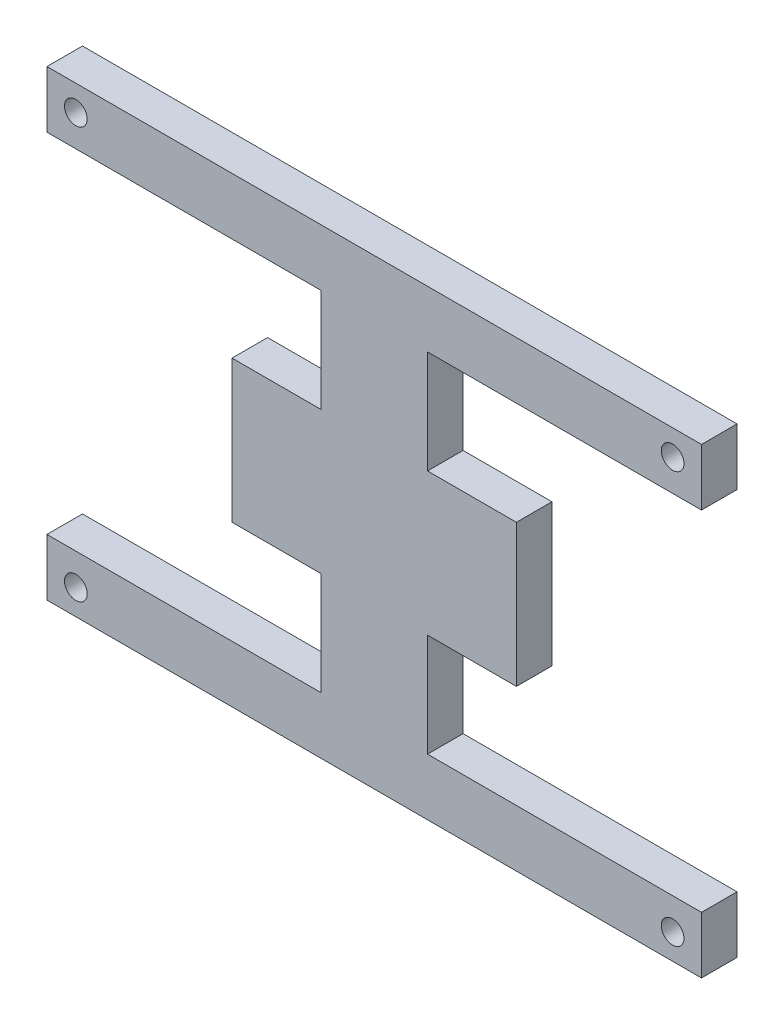
ISO-10303-21;
HEADER;
FILE_DESCRIPTION(('STEP AP214'),'2;1');
FILE_NAME('part.step','',(''),(''),'','','');
FILE_SCHEMA(('AUTOMOTIVE_DESIGN { 1 0 10303 214 1 1 1 1 }'));
ENDSEC;
DATA;
#1=APPLICATION_CONTEXT('core data for automotive mechanical design processes');
#2=APPLICATION_PROTOCOL_DEFINITION('international standard','automotive_design',2000,#1);
#3=PRODUCT_CONTEXT('',#1,'mechanical');
#4=PRODUCT('Part','Part','',(#3));
#5=PRODUCT_RELATED_PRODUCT_CATEGORY('part','',(#4));
#6=PRODUCT_DEFINITION_FORMATION('','',#4);
#7=PRODUCT_DEFINITION_CONTEXT('part definition',#1,'design');
#8=PRODUCT_DEFINITION('design','',#6,#7);
#9=PRODUCT_DEFINITION_SHAPE('','',#8);
#10=(LENGTH_UNIT() NAMED_UNIT(*) SI_UNIT(.MILLI.,.METRE.));
#11=(NAMED_UNIT(*) PLANE_ANGLE_UNIT() SI_UNIT($,.RADIAN.));
#12=(NAMED_UNIT(*) SI_UNIT($,.STERADIAN.) SOLID_ANGLE_UNIT());
#13=UNCERTAINTY_MEASURE_WITH_UNIT(LENGTH_MEASURE(1.E-05),#10,'distance_accuracy_value','');
#14=(GEOMETRIC_REPRESENTATION_CONTEXT(3) GLOBAL_UNCERTAINTY_ASSIGNED_CONTEXT((#13)) GLOBAL_UNIT_ASSIGNED_CONTEXT((#10,
#11,#12)) REPRESENTATION_CONTEXT('',''));
#15=CARTESIAN_POINT('',(0.,0.,0.));
#16=DIRECTION('',(0.,0.,1.));
#17=DIRECTION('',(1.,0.,0.));
#18=AXIS2_PLACEMENT_3D('',#15,#16,#17);
#19=CARTESIAN_POINT('',(46.0375,0.,5.));
#20=DIRECTION('',(1.,0.,0.));
#21=DIRECTION('',(0.,0.,-1.));
#22=AXIS2_PLACEMENT_3D('',#19,#20,#21);
#23=PLANE('',#22);
#24=DIRECTION('',(0.,-1.,0.));
#25=VECTOR('',#24,1.);
#26=CARTESIAN_POINT('',(46.0375,0.,0.));
#27=LINE('',#26,#25);
#28=CARTESIAN_POINT('',(46.0375,32.5,0.));
#29=VERTEX_POINT('',#28);
#30=CARTESIAN_POINT('',(46.0375,24.5,0.));
#31=VERTEX_POINT('',#30);
#32=EDGE_CURVE('E218',#29,#31,#27,.T.);
#33=ORIENTED_EDGE('',*,*,#32,.F.);
#34=DIRECTION('',(0.,0.,-1.));
#35=VECTOR('',#34,1.);
#36=CARTESIAN_POINT('',(46.0375,32.5,5.));
#37=LINE('',#36,#35);
#38=CARTESIAN_POINT('',(46.0375,32.5,5.));
#39=VERTEX_POINT('',#38);
#40=EDGE_CURVE('E11',#39,#29,#37,.T.);
#41=ORIENTED_EDGE('',*,*,#40,.F.);
#42=DIRECTION('',(0.,-1.,0.));
#43=VECTOR('',#42,1.);
#44=CARTESIAN_POINT('',(46.0375,0.,5.));
#45=LINE('',#44,#43);
#46=CARTESIAN_POINT('',(46.0375,24.5,5.));
#47=VERTEX_POINT('',#46);
#48=EDGE_CURVE('E678',#39,#47,#45,.T.);
#49=ORIENTED_EDGE('',*,*,#48,.T.);
#50=DIRECTION('',(0.,0.,-1.));
#51=VECTOR('',#50,1.);
#52=CARTESIAN_POINT('',(46.0375,24.5,5.));
#53=LINE('',#52,#51);
#54=EDGE_CURVE('E125',#47,#31,#53,.T.);
#55=ORIENTED_EDGE('',*,*,#54,.T.);
#56=EDGE_LOOP('',(#33,#41,#49,#55));
#57=FACE_BOUND('',#56,.T.);
#58=ADVANCED_FACE('F37',(#57),#23,.T.);
#59=CARTESIAN_POINT('',(0.,32.5,5.));
#60=DIRECTION('',(0.,1.,0.));
#61=DIRECTION('',(0.,0.,1.));
#62=AXIS2_PLACEMENT_3D('',#59,#60,#61);
#63=PLANE('',#62);
#64=DIRECTION('',(1.,0.,0.));
#65=VECTOR('',#64,1.);
#66=CARTESIAN_POINT('',(0.,32.5,0.));
#67=LINE('',#66,#65);
#68=CARTESIAN_POINT('',(-46.0375,32.5,0.));
#69=VERTEX_POINT('',#68);
#70=EDGE_CURVE('E220',#69,#29,#67,.T.);
#71=ORIENTED_EDGE('',*,*,#70,.F.);
#72=DIRECTION('',(0.,0.,-1.));
#73=VECTOR('',#72,1.);
#74=CARTESIAN_POINT('',(-46.0375,32.5,5.));
#75=LINE('',#74,#73);
#76=CARTESIAN_POINT('',(-46.0375,32.5,5.));
#77=VERTEX_POINT('',#76);
#78=EDGE_CURVE('E46',#77,#69,#75,.T.);
#79=ORIENTED_EDGE('',*,*,#78,.F.);
#80=DIRECTION('',(1.,0.,0.));
#81=VECTOR('',#80,1.);
#82=CARTESIAN_POINT('',(0.,32.5,5.));
#83=LINE('',#82,#81);
#84=EDGE_CURVE('E325',#77,#39,#83,.T.);
#85=ORIENTED_EDGE('',*,*,#84,.T.);
#86=ORIENTED_EDGE('',*,*,#40,.T.);
#87=EDGE_LOOP('',(#71,#79,#85,#86));
#88=FACE_BOUND('',#87,.T.);
#89=ADVANCED_FACE('F324',(#88),#63,.T.);
#90=CARTESIAN_POINT('',(-46.0375,0.,5.));
#91=DIRECTION('',(1.,0.,0.));
#92=DIRECTION('',(0.,1.,0.));
#93=AXIS2_PLACEMENT_3D('',#90,#91,#92);
#94=PLANE('',#93);
#95=DIRECTION('',(0.,-1.,0.));
#96=VECTOR('',#95,1.);
#97=CARTESIAN_POINT('',(-46.0375,0.,0.));
#98=LINE('',#97,#96);
#99=CARTESIAN_POINT('',(-46.0375,24.5,0.));
#100=VERTEX_POINT('',#99);
#101=EDGE_CURVE('E223',#69,#100,#98,.T.);
#102=ORIENTED_EDGE('',*,*,#101,.T.);
#103=DIRECTION('',(0.,0.,-1.));
#104=VECTOR('',#103,1.);
#105=CARTESIAN_POINT('',(-46.0375,24.5,5.));
#106=LINE('',#105,#104);
#107=CARTESIAN_POINT('',(-46.0375,24.5,5.));
#108=VERTEX_POINT('',#107);
#109=EDGE_CURVE('E309',#108,#100,#106,.T.);
#110=ORIENTED_EDGE('',*,*,#109,.F.);
#111=DIRECTION('',(0.,-1.,0.));
#112=VECTOR('',#111,1.);
#113=CARTESIAN_POINT('',(-46.0375,0.,5.));
#114=LINE('',#113,#112);
#115=EDGE_CURVE('E317',#77,#108,#114,.T.);
#116=ORIENTED_EDGE('',*,*,#115,.F.);
#117=ORIENTED_EDGE('',*,*,#78,.T.);
#118=EDGE_LOOP('',(#102,#110,#116,#117));
#119=FACE_BOUND('',#118,.T.);
#120=ADVANCED_FACE('F314',(#119),#94,.F.);
#121=CARTESIAN_POINT('',(0.,24.5,5.));
#122=DIRECTION('',(0.,1.,0.));
#123=DIRECTION('',(0.,0.,1.));
#124=AXIS2_PLACEMENT_3D('',#121,#122,#123);
#125=PLANE('',#124);
#126=DIRECTION('',(1.,0.,0.));
#127=VECTOR('',#126,1.);
#128=CARTESIAN_POINT('',(0.,24.5,0.));
#129=LINE('',#128,#127);
#130=CARTESIAN_POINT('',(-7.5,24.5,0.));
#131=VERTEX_POINT('',#130);
#132=EDGE_CURVE('E226',#100,#131,#129,.T.);
#133=ORIENTED_EDGE('',*,*,#132,.T.);
#134=DIRECTION('',(0.,0.,-1.));
#135=VECTOR('',#134,1.);
#136=CARTESIAN_POINT('',(-7.5,24.5,5.));
#137=LINE('',#136,#135);
#138=CARTESIAN_POINT('',(-7.5,24.5,5.));
#139=VERTEX_POINT('',#138);
#140=EDGE_CURVE('E307',#139,#131,#137,.T.);
#141=ORIENTED_EDGE('',*,*,#140,.F.);
#142=DIRECTION('',(1.,0.,0.));
#143=VECTOR('',#142,1.);
#144=CARTESIAN_POINT('',(0.,24.5,5.));
#145=LINE('',#144,#143);
#146=EDGE_CURVE('E436',#108,#139,#145,.T.);
#147=ORIENTED_EDGE('',*,*,#146,.F.);
#148=ORIENTED_EDGE('',*,*,#109,.T.);
#149=EDGE_LOOP('',(#133,#141,#147,#148));
#150=FACE_BOUND('',#149,.T.);
#151=ADVANCED_FACE('F346',(#150),#125,.F.);
#152=CARTESIAN_POINT('',(-7.5,0.,5.));
#153=DIRECTION('',(-1.,0.,0.));
#154=DIRECTION('',(0.,0.,1.));
#155=AXIS2_PLACEMENT_3D('',#152,#153,#154);
#156=PLANE('',#155);
#157=DIRECTION('',(0.,1.,0.));
#158=VECTOR('',#157,1.);
#159=CARTESIAN_POINT('',(-7.5,0.,0.));
#160=LINE('',#159,#158);
#161=CARTESIAN_POINT('',(-7.5,10.,0.));
#162=VERTEX_POINT('',#161);
#163=EDGE_CURVE('E229',#162,#131,#160,.T.);
#164=ORIENTED_EDGE('',*,*,#163,.F.);
#165=DIRECTION('',(0.,0.,-1.));
#166=VECTOR('',#165,1.);
#167=CARTESIAN_POINT('',(-7.5,10.,5.));
#168=LINE('',#167,#166);
#169=CARTESIAN_POINT('',(-7.5,10.,5.));
#170=VERTEX_POINT('',#169);
#171=EDGE_CURVE('E305',#170,#162,#168,.T.);
#172=ORIENTED_EDGE('',*,*,#171,.F.);
#173=DIRECTION('',(0.,1.,0.));
#174=VECTOR('',#173,1.);
#175=CARTESIAN_POINT('',(-7.5,0.,5.));
#176=LINE('',#175,#174);
#177=EDGE_CURVE('E432',#170,#139,#176,.T.);
#178=ORIENTED_EDGE('',*,*,#177,.T.);
#179=ORIENTED_EDGE('',*,*,#140,.T.);
#180=EDGE_LOOP('',(#164,#172,#178,#179));
#181=FACE_BOUND('',#180,.T.);
#182=ADVANCED_FACE('F416',(#181),#156,.T.);
#183=CARTESIAN_POINT('',(0.,10.,5.));
#184=DIRECTION('',(0.,1.,0.));
#185=DIRECTION('',(0.,0.,1.));
#186=AXIS2_PLACEMENT_3D('',#183,#184,#185);
#187=PLANE('',#186);
#188=DIRECTION('',(1.,0.,0.));
#189=VECTOR('',#188,1.);
#190=CARTESIAN_POINT('',(0.,10.,0.));
#191=LINE('',#190,#189);
#192=CARTESIAN_POINT('',(-20.,10.,0.));
#193=VERTEX_POINT('',#192);
#194=EDGE_CURVE('E232',#193,#162,#191,.T.);
#195=ORIENTED_EDGE('',*,*,#194,.F.);
#196=DIRECTION('',(0.,0.,-1.));
#197=VECTOR('',#196,1.);
#198=CARTESIAN_POINT('',(-20.,10.,5.));
#199=LINE('',#198,#197);
#200=CARTESIAN_POINT('',(-20.,10.,5.));
#201=VERTEX_POINT('',#200);
#202=EDGE_CURVE('E303',#201,#193,#199,.T.);
#203=ORIENTED_EDGE('',*,*,#202,.F.);
#204=DIRECTION('',(1.,0.,0.));
#205=VECTOR('',#204,1.);
#206=CARTESIAN_POINT('',(0.,10.,5.));
#207=LINE('',#206,#205);
#208=EDGE_CURVE('E435',#201,#170,#207,.T.);
#209=ORIENTED_EDGE('',*,*,#208,.T.);
#210=ORIENTED_EDGE('',*,*,#171,.T.);
#211=EDGE_LOOP('',(#195,#203,#209,#210));
#212=FACE_BOUND('',#211,.T.);
#213=ADVANCED_FACE('F412',(#212),#187,.T.);
#214=CARTESIAN_POINT('',(-20.,0.,5.));
#215=DIRECTION('',(-1.,0.,0.));
#216=DIRECTION('',(0.,0.,1.));
#217=AXIS2_PLACEMENT_3D('',#214,#215,#216);
#218=PLANE('',#217);
#219=DIRECTION('',(0.,1.,0.));
#220=VECTOR('',#219,1.);
#221=CARTESIAN_POINT('',(-20.,0.,0.));
#222=LINE('',#221,#220);
#223=CARTESIAN_POINT('',(-20.,-10.,0.));
#224=VERTEX_POINT('',#223);
#225=EDGE_CURVE('E235',#224,#193,#222,.T.);
#226=ORIENTED_EDGE('',*,*,#225,.F.);
#227=DIRECTION('',(0.,0.,-1.));
#228=VECTOR('',#227,1.);
#229=CARTESIAN_POINT('',(-20.,-10.,5.));
#230=LINE('',#229,#228);
#231=CARTESIAN_POINT('',(-20.,-10.,5.));
#232=VERTEX_POINT('',#231);
#233=EDGE_CURVE('E301',#232,#224,#230,.T.);
#234=ORIENTED_EDGE('',*,*,#233,.F.);
#235=DIRECTION('',(0.,1.,0.));
#236=VECTOR('',#235,1.);
#237=CARTESIAN_POINT('',(-20.,0.,5.));
#238=LINE('',#237,#236);
#239=EDGE_CURVE('E438',#232,#201,#238,.T.);
#240=ORIENTED_EDGE('',*,*,#239,.T.);
#241=ORIENTED_EDGE('',*,*,#202,.T.);
#242=EDGE_LOOP('',(#226,#234,#240,#241));
#243=FACE_BOUND('',#242,.T.);
#244=ADVANCED_FACE('F408',(#243),#218,.T.);
#245=CARTESIAN_POINT('',(0.,-10.,5.));
#246=DIRECTION('',(0.,1.,0.));
#247=DIRECTION('',(0.,0.,1.));
#248=AXIS2_PLACEMENT_3D('',#245,#246,#247);
#249=PLANE('',#248);
#250=DIRECTION('',(1.,0.,0.));
#251=VECTOR('',#250,1.);
#252=CARTESIAN_POINT('',(0.,-10.,0.));
#253=LINE('',#252,#251);
#254=CARTESIAN_POINT('',(-7.5,-10.,0.));
#255=VERTEX_POINT('',#254);
#256=EDGE_CURVE('E238',#224,#255,#253,.T.);
#257=ORIENTED_EDGE('',*,*,#256,.T.);
#258=DIRECTION('',(0.,0.,-1.));
#259=VECTOR('',#258,1.);
#260=CARTESIAN_POINT('',(-7.5,-10.,5.));
#261=LINE('',#260,#259);
#262=CARTESIAN_POINT('',(-7.5,-10.,5.));
#263=VERTEX_POINT('',#262);
#264=EDGE_CURVE('E299',#263,#255,#261,.T.);
#265=ORIENTED_EDGE('',*,*,#264,.F.);
#266=DIRECTION('',(1.,0.,0.));
#267=VECTOR('',#266,1.);
#268=CARTESIAN_POINT('',(0.,-10.,5.));
#269=LINE('',#268,#267);
#270=EDGE_CURVE('E445',#232,#263,#269,.T.);
#271=ORIENTED_EDGE('',*,*,#270,.F.);
#272=ORIENTED_EDGE('',*,*,#233,.T.);
#273=EDGE_LOOP('',(#257,#265,#271,#272));
#274=FACE_BOUND('',#273,.T.);
#275=ADVANCED_FACE('F404',(#274),#249,.F.);
#276=CARTESIAN_POINT('',(-7.5,0.,5.));
#277=DIRECTION('',(-1.,0.,0.));
#278=DIRECTION('',(0.,0.,1.));
#279=AXIS2_PLACEMENT_3D('',#276,#277,#278);
#280=PLANE('',#279);
#281=DIRECTION('',(0.,1.,0.));
#282=VECTOR('',#281,1.);
#283=CARTESIAN_POINT('',(-7.5,0.,0.));
#284=LINE('',#283,#282);
#285=CARTESIAN_POINT('',(-7.5,-24.5,0.));
#286=VERTEX_POINT('',#285);
#287=EDGE_CURVE('E241',#286,#255,#284,.T.);
#288=ORIENTED_EDGE('',*,*,#287,.F.);
#289=DIRECTION('',(0.,0.,-1.));
#290=VECTOR('',#289,1.);
#291=CARTESIAN_POINT('',(-7.5,-24.5,5.));
#292=LINE('',#291,#290);
#293=CARTESIAN_POINT('',(-7.5,-24.5,5.));
#294=VERTEX_POINT('',#293);
#295=EDGE_CURVE('E297',#294,#286,#292,.T.);
#296=ORIENTED_EDGE('',*,*,#295,.F.);
#297=DIRECTION('',(0.,1.,0.));
#298=VECTOR('',#297,1.);
#299=CARTESIAN_POINT('',(-7.5,0.,5.));
#300=LINE('',#299,#298);
#301=EDGE_CURVE('E447',#294,#263,#300,.T.);
#302=ORIENTED_EDGE('',*,*,#301,.T.);
#303=ORIENTED_EDGE('',*,*,#264,.T.);
#304=EDGE_LOOP('',(#288,#296,#302,#303));
#305=FACE_BOUND('',#304,.T.);
#306=ADVANCED_FACE('F401',(#305),#280,.T.);
#307=CARTESIAN_POINT('',(0.,-24.5,5.));
#308=DIRECTION('',(0.,-1.,0.));
#309=DIRECTION('',(1.,0.,0.));
#310=AXIS2_PLACEMENT_3D('',#307,#308,#309);
#311=PLANE('',#310);
#312=DIRECTION('',(-1.,0.,0.));
#313=VECTOR('',#312,1.);
#314=CARTESIAN_POINT('',(0.,-24.5,0.));
#315=LINE('',#314,#313);
#316=CARTESIAN_POINT('',(-46.0375,-24.5,0.));
#317=VERTEX_POINT('',#316);
#318=EDGE_CURVE('E244',#286,#317,#315,.T.);
#319=ORIENTED_EDGE('',*,*,#318,.T.);
#320=DIRECTION('',(0.,0.,-1.));
#321=VECTOR('',#320,1.);
#322=CARTESIAN_POINT('',(-46.0375,-24.5,5.));
#323=LINE('',#322,#321);
#324=CARTESIAN_POINT('',(-46.0375,-24.5,5.));
#325=VERTEX_POINT('',#324);
#326=EDGE_CURVE('E295',#325,#317,#323,.T.);
#327=ORIENTED_EDGE('',*,*,#326,.F.);
#328=DIRECTION('',(-1.,0.,0.));
#329=VECTOR('',#328,1.);
#330=CARTESIAN_POINT('',(0.,-24.5,5.));
#331=LINE('',#330,#329);
#332=EDGE_CURVE('E450',#294,#325,#331,.T.);
#333=ORIENTED_EDGE('',*,*,#332,.F.);
#334=ORIENTED_EDGE('',*,*,#295,.T.);
#335=EDGE_LOOP('',(#319,#327,#333,#334));
#336=FACE_BOUND('',#335,.T.);
#337=ADVANCED_FACE('F389',(#336),#311,.F.);
#338=CARTESIAN_POINT('',(-46.0375,0.,5.));
#339=DIRECTION('',(-1.,0.,0.));
#340=DIRECTION('',(0.,-1.,0.));
#341=AXIS2_PLACEMENT_3D('',#338,#339,#340);
#342=PLANE('',#341);
#343=DIRECTION('',(0.,1.,0.));
#344=VECTOR('',#343,1.);
#345=CARTESIAN_POINT('',(-46.0375,0.,0.));
#346=LINE('',#345,#344);
#347=CARTESIAN_POINT('',(-46.0375,-32.5,0.));
#348=VERTEX_POINT('',#347);
#349=EDGE_CURVE('E247',#348,#317,#346,.T.);
#350=ORIENTED_EDGE('',*,*,#349,.F.);
#351=DIRECTION('',(0.,0.,-1.));
#352=VECTOR('',#351,1.);
#353=CARTESIAN_POINT('',(-46.0375,-32.5,5.));
#354=LINE('',#353,#352);
#355=CARTESIAN_POINT('',(-46.0375,-32.5,5.));
#356=VERTEX_POINT('',#355);
#357=EDGE_CURVE('E293',#356,#348,#354,.T.);
#358=ORIENTED_EDGE('',*,*,#357,.F.);
#359=DIRECTION('',(0.,1.,0.));
#360=VECTOR('',#359,1.);
#361=CARTESIAN_POINT('',(-46.0375,0.,5.));
#362=LINE('',#361,#360);
#363=EDGE_CURVE('E452',#356,#325,#362,.T.);
#364=ORIENTED_EDGE('',*,*,#363,.T.);
#365=ORIENTED_EDGE('',*,*,#326,.T.);
#366=EDGE_LOOP('',(#350,#358,#364,#365));
#367=FACE_BOUND('',#366,.T.);
#368=ADVANCED_FACE('F396',(#367),#342,.T.);
#369=CARTESIAN_POINT('',(0.,-32.5,5.));
#370=DIRECTION('',(0.,-1.,0.));
#371=DIRECTION('',(0.,0.,-1.));
#372=AXIS2_PLACEMENT_3D('',#369,#370,#371);
#373=PLANE('',#372);
#374=DIRECTION('',(-1.,0.,0.));
#375=VECTOR('',#374,1.);
#376=CARTESIAN_POINT('',(0.,-32.5,0.));
#377=LINE('',#376,#375);
#378=CARTESIAN_POINT('',(46.0375,-32.5,0.));
#379=VERTEX_POINT('',#378);
#380=EDGE_CURVE('E251',#379,#348,#377,.T.);
#381=ORIENTED_EDGE('',*,*,#380,.F.);
#382=DIRECTION('',(0.,0.,-1.));
#383=VECTOR('',#382,1.);
#384=CARTESIAN_POINT('',(46.0375,-32.5,5.));
#385=LINE('',#384,#383);
#386=CARTESIAN_POINT('',(46.0375,-32.5,5.));
#387=VERTEX_POINT('',#386);
#388=EDGE_CURVE('E291',#387,#379,#385,.T.);
#389=ORIENTED_EDGE('',*,*,#388,.F.);
#390=DIRECTION('',(-1.,0.,0.));
#391=VECTOR('',#390,1.);
#392=CARTESIAN_POINT('',(0.,-32.5,5.));
#393=LINE('',#392,#391);
#394=EDGE_CURVE('E456',#387,#356,#393,.T.);
#395=ORIENTED_EDGE('',*,*,#394,.T.);
#396=ORIENTED_EDGE('',*,*,#357,.T.);
#397=EDGE_LOOP('',(#381,#389,#395,#396));
#398=FACE_BOUND('',#397,.T.);
#399=ADVANCED_FACE('F392',(#398),#373,.T.);
#400=CARTESIAN_POINT('',(46.0375,0.,5.));
#401=DIRECTION('',(-1.,0.,0.));
#402=DIRECTION('',(0.,0.,1.));
#403=AXIS2_PLACEMENT_3D('',#400,#401,#402);
#404=PLANE('',#403);
#405=DIRECTION('',(0.,1.,0.));
#406=VECTOR('',#405,1.);
#407=CARTESIAN_POINT('',(46.0375,0.,0.));
#408=LINE('',#407,#406);
#409=CARTESIAN_POINT('',(46.0375,-24.5,0.));
#410=VERTEX_POINT('',#409);
#411=EDGE_CURVE('E254',#379,#410,#408,.T.);
#412=ORIENTED_EDGE('',*,*,#411,.T.);
#413=DIRECTION('',(0.,0.,-1.));
#414=VECTOR('',#413,1.);
#415=CARTESIAN_POINT('',(46.0375,-24.5,5.));
#416=LINE('',#415,#414);
#417=CARTESIAN_POINT('',(46.0375,-24.5,5.));
#418=VERTEX_POINT('',#417);
#419=EDGE_CURVE('E288',#418,#410,#416,.T.);
#420=ORIENTED_EDGE('',*,*,#419,.F.);
#421=DIRECTION('',(0.,1.,0.));
#422=VECTOR('',#421,1.);
#423=CARTESIAN_POINT('',(46.0375,0.,5.));
#424=LINE('',#423,#422);
#425=EDGE_CURVE('E459',#387,#418,#424,.T.);
#426=ORIENTED_EDGE('',*,*,#425,.F.);
#427=ORIENTED_EDGE('',*,*,#388,.T.);
#428=EDGE_LOOP('',(#412,#420,#426,#427));
#429=FACE_BOUND('',#428,.T.);
#430=ADVANCED_FACE('F387',(#429),#404,.F.);
#431=CARTESIAN_POINT('',(7.5,-24.5,0.));
#432=VERTEX_POINT('',#431);
#433=EDGE_CURVE('E248',#410,#432,#315,.T.);
#434=ORIENTED_EDGE('',*,*,#433,.T.);
#435=DIRECTION('',(0.,0.,-1.));
#436=VECTOR('',#435,1.);
#437=CARTESIAN_POINT('',(7.5,-24.5,5.));
#438=LINE('',#437,#436);
#439=CARTESIAN_POINT('',(7.5,-24.5,5.));
#440=VERTEX_POINT('',#439);
#441=EDGE_CURVE('E285',#440,#432,#438,.T.);
#442=ORIENTED_EDGE('',*,*,#441,.F.);
#443=EDGE_CURVE('E453',#418,#440,#331,.T.);
#444=ORIENTED_EDGE('',*,*,#443,.F.);
#445=ORIENTED_EDGE('',*,*,#419,.T.);
#446=EDGE_LOOP('',(#434,#442,#444,#445));
#447=FACE_BOUND('',#446,.T.);
#448=ADVANCED_FACE('F383',(#447),#311,.F.);
#449=CARTESIAN_POINT('',(7.5,0.,5.));
#450=DIRECTION('',(-1.,0.,0.));
#451=DIRECTION('',(0.,0.,1.));
#452=AXIS2_PLACEMENT_3D('',#449,#450,#451);
#453=PLANE('',#452);
#454=DIRECTION('',(0.,1.,0.));
#455=VECTOR('',#454,1.);
#456=CARTESIAN_POINT('',(7.5,0.,0.));
#457=LINE('',#456,#455);
#458=CARTESIAN_POINT('',(7.5,-10.,0.));
#459=VERTEX_POINT('',#458);
#460=EDGE_CURVE('E257',#432,#459,#457,.T.);
#461=ORIENTED_EDGE('',*,*,#460,.T.);
#462=DIRECTION('',(0.,0.,-1.));
#463=VECTOR('',#462,1.);
#464=CARTESIAN_POINT('',(7.5,-10.,5.));
#465=LINE('',#464,#463);
#466=CARTESIAN_POINT('',(7.5,-10.,5.));
#467=VERTEX_POINT('',#466);
#468=EDGE_CURVE('E282',#467,#459,#465,.T.);
#469=ORIENTED_EDGE('',*,*,#468,.F.);
#470=DIRECTION('',(0.,1.,0.));
#471=VECTOR('',#470,1.);
#472=CARTESIAN_POINT('',(7.5,0.,5.));
#473=LINE('',#472,#471);
#474=EDGE_CURVE('E462',#440,#467,#473,.T.);
#475=ORIENTED_EDGE('',*,*,#474,.F.);
#476=ORIENTED_EDGE('',*,*,#441,.T.);
#477=EDGE_LOOP('',(#461,#469,#475,#476));
#478=FACE_BOUND('',#477,.T.);
#479=ADVANCED_FACE('F379',(#478),#453,.F.);
#480=CARTESIAN_POINT('',(0.,-10.,5.));
#481=DIRECTION('',(0.,1.,0.));
#482=DIRECTION('',(0.,0.,1.));
#483=AXIS2_PLACEMENT_3D('',#480,#481,#482);
#484=PLANE('',#483);
#485=DIRECTION('',(1.,0.,0.));
#486=VECTOR('',#485,1.);
#487=CARTESIAN_POINT('',(0.,-10.,0.));
#488=LINE('',#487,#486);
#489=CARTESIAN_POINT('',(20.,-10.,0.));
#490=VERTEX_POINT('',#489);
#491=EDGE_CURVE('E260',#459,#490,#488,.T.);
#492=ORIENTED_EDGE('',*,*,#491,.T.);
#493=DIRECTION('',(0.,0.,-1.));
#494=VECTOR('',#493,1.);
#495=CARTESIAN_POINT('',(20.,-10.,5.));
#496=LINE('',#495,#494);
#497=CARTESIAN_POINT('',(20.,-10.,5.));
#498=VERTEX_POINT('',#497);
#499=EDGE_CURVE('E279',#498,#490,#496,.T.);
#500=ORIENTED_EDGE('',*,*,#499,.F.);
#501=DIRECTION('',(1.,0.,0.));
#502=VECTOR('',#501,1.);
#503=CARTESIAN_POINT('',(0.,-10.,5.));
#504=LINE('',#503,#502);
#505=EDGE_CURVE('E202',#467,#498,#504,.T.);
#506=ORIENTED_EDGE('',*,*,#505,.F.);
#507=ORIENTED_EDGE('',*,*,#468,.T.);
#508=EDGE_LOOP('',(#492,#500,#506,#507));
#509=FACE_BOUND('',#508,.T.);
#510=ADVANCED_FACE('F375',(#509),#484,.F.);
#511=CARTESIAN_POINT('',(20.,0.,5.));
#512=DIRECTION('',(-1.,0.,0.));
#513=DIRECTION('',(0.,0.,1.));
#514=AXIS2_PLACEMENT_3D('',#511,#512,#513);
#515=PLANE('',#514);
#516=DIRECTION('',(0.,1.,0.));
#517=VECTOR('',#516,1.);
#518=CARTESIAN_POINT('',(20.,0.,0.));
#519=LINE('',#518,#517);
#520=CARTESIAN_POINT('',(20.,10.,0.));
#521=VERTEX_POINT('',#520);
#522=EDGE_CURVE('E263',#490,#521,#519,.T.);
#523=ORIENTED_EDGE('',*,*,#522,.T.);
#524=DIRECTION('',(0.,0.,-1.));
#525=VECTOR('',#524,1.);
#526=CARTESIAN_POINT('',(20.,10.,5.));
#527=LINE('',#526,#525);
#528=CARTESIAN_POINT('',(20.,10.,5.));
#529=VERTEX_POINT('',#528);
#530=EDGE_CURVE('E189',#529,#521,#527,.T.);
#531=ORIENTED_EDGE('',*,*,#530,.F.);
#532=DIRECTION('',(0.,1.,0.));
#533=VECTOR('',#532,1.);
#534=CARTESIAN_POINT('',(20.,0.,5.));
#535=LINE('',#534,#533);
#536=EDGE_CURVE('E199',#498,#529,#535,.T.);
#537=ORIENTED_EDGE('',*,*,#536,.F.);
#538=ORIENTED_EDGE('',*,*,#499,.T.);
#539=EDGE_LOOP('',(#523,#531,#537,#538));
#540=FACE_BOUND('',#539,.T.);
#541=ADVANCED_FACE('F372',(#540),#515,.F.);
#542=CARTESIAN_POINT('',(0.,10.,5.));
#543=DIRECTION('',(0.,1.,0.));
#544=DIRECTION('',(0.,0.,1.));
#545=AXIS2_PLACEMENT_3D('',#542,#543,#544);
#546=PLANE('',#545);
#547=DIRECTION('',(1.,0.,0.));
#548=VECTOR('',#547,1.);
#549=CARTESIAN_POINT('',(0.,10.,0.));
#550=LINE('',#549,#548);
#551=CARTESIAN_POINT('',(7.5,10.,0.));
#552=VERTEX_POINT('',#551);
#553=EDGE_CURVE('E186',#552,#521,#550,.T.);
#554=ORIENTED_EDGE('',*,*,#553,.F.);
#555=DIRECTION('',(0.,0.,-1.));
#556=VECTOR('',#555,1.);
#557=CARTESIAN_POINT('',(7.5,10.,5.));
#558=LINE('',#557,#556);
#559=CARTESIAN_POINT('',(7.5,10.,5.));
#560=VERTEX_POINT('',#559);
#561=EDGE_CURVE('E180',#560,#552,#558,.T.);
#562=ORIENTED_EDGE('',*,*,#561,.F.);
#563=DIRECTION('',(1.,0.,0.));
#564=VECTOR('',#563,1.);
#565=CARTESIAN_POINT('',(0.,10.,5.));
#566=LINE('',#565,#564);
#567=EDGE_CURVE('E184',#560,#529,#566,.T.);
#568=ORIENTED_EDGE('',*,*,#567,.T.);
#569=ORIENTED_EDGE('',*,*,#530,.T.);
#570=EDGE_LOOP('',(#554,#562,#568,#569));
#571=FACE_BOUND('',#570,.T.);
#572=ADVANCED_FACE('F182',(#571),#546,.T.);
#573=CARTESIAN_POINT('',(7.5,0.,5.));
#574=DIRECTION('',(-1.,0.,0.));
#575=DIRECTION('',(0.,0.,1.));
#576=AXIS2_PLACEMENT_3D('',#573,#574,#575);
#577=PLANE('',#576);
#578=DIRECTION('',(0.,1.,0.));
#579=VECTOR('',#578,1.);
#580=CARTESIAN_POINT('',(7.5,0.,0.));
#581=LINE('',#580,#579);
#582=CARTESIAN_POINT('',(7.5,24.5,0.));
#583=VERTEX_POINT('',#582);
#584=EDGE_CURVE('E267',#552,#583,#581,.T.);
#585=ORIENTED_EDGE('',*,*,#584,.T.);
#586=DIRECTION('',(0.,0.,-1.));
#587=VECTOR('',#586,1.);
#588=CARTESIAN_POINT('',(7.5,24.5,5.));
#589=LINE('',#588,#587);
#590=CARTESIAN_POINT('',(7.5,24.5,5.));
#591=VERTEX_POINT('',#590);
#592=EDGE_CURVE('E190',#591,#583,#589,.T.);
#593=ORIENTED_EDGE('',*,*,#592,.F.);
#594=DIRECTION('',(0.,1.,0.));
#595=VECTOR('',#594,1.);
#596=CARTESIAN_POINT('',(7.5,0.,5.));
#597=LINE('',#596,#595);
#598=EDGE_CURVE('E193',#560,#591,#597,.T.);
#599=ORIENTED_EDGE('',*,*,#598,.F.);
#600=ORIENTED_EDGE('',*,*,#561,.T.);
#601=EDGE_LOOP('',(#585,#593,#599,#600));
#602=FACE_BOUND('',#601,.T.);
#603=ADVANCED_FACE('F194',(#602),#577,.F.);
#604=CARTESIAN_POINT('',(-41.9735,-28.92,5.));
#605=DIRECTION('',(0.,0.,-1.));
#606=DIRECTION('',(-1.,0.,0.));
#607=AXIS2_PLACEMENT_3D('',#604,#605,#606);
#608=CYLINDRICAL_SURFACE('',#607,1.6);
#609=CARTESIAN_POINT('',(-41.9735,-28.92,5.));
#610=DIRECTION('',(0.,0.,1.));
#611=DIRECTION('',(1.,0.,0.));
#612=AXIS2_PLACEMENT_3D('',#609,#610,#611);
#613=CIRCLE('',#612,1.6);
#614=CARTESIAN_POINT('',(-40.3735,-28.92,5.));
#615=VERTEX_POINT('',#614);
#616=EDGE_CURVE('E206',#615,#615,#613,.T.);
#617=ORIENTED_EDGE('',*,*,#616,.T.);
#618=EDGE_LOOP('',(#617));
#619=FACE_BOUND('',#618,.T.);
#620=CARTESIAN_POINT('',(-41.9735,-28.92,0.));
#621=DIRECTION('',(0.,0.,1.));
#622=DIRECTION('',(1.,0.,0.));
#623=AXIS2_PLACEMENT_3D('',#620,#621,#622);
#624=CIRCLE('',#623,1.6);
#625=CARTESIAN_POINT('',(-40.3735,-28.92,0.));
#626=VERTEX_POINT('',#625);
#627=EDGE_CURVE('E269',#626,#626,#624,.T.);
#628=ORIENTED_EDGE('',*,*,#627,.F.);
#629=EDGE_LOOP('',(#628));
#630=FACE_BOUND('',#629,.T.);
#631=ADVANCED_FACE('F343',(#619,#630),#608,.F.);
#632=EDGE_CURVE('E118',#583,#31,#129,.T.);
#633=ORIENTED_EDGE('',*,*,#632,.T.);
#634=ORIENTED_EDGE('',*,*,#54,.F.);
#635=EDGE_CURVE('E54',#591,#47,#145,.T.);
#636=ORIENTED_EDGE('',*,*,#635,.F.);
#637=ORIENTED_EDGE('',*,*,#592,.T.);
#638=EDGE_LOOP('',(#633,#634,#636,#637));
#639=FACE_BOUND('',#638,.T.);
#640=ADVANCED_FACE('F335',(#639),#125,.F.);
#641=CARTESIAN_POINT('',(-41.9735,28.92,5.));
#642=DIRECTION('',(0.,0.,-1.));
#643=DIRECTION('',(-1.,0.,0.));
#644=AXIS2_PLACEMENT_3D('',#641,#642,#643);
#645=CYLINDRICAL_SURFACE('',#644,1.6);
#646=CARTESIAN_POINT('',(-41.9735,28.92,5.));
#647=DIRECTION('',(0.,0.,1.));
#648=DIRECTION('',(1.,0.,0.));
#649=AXIS2_PLACEMENT_3D('',#646,#647,#648);
#650=CIRCLE('',#649,1.6);
#651=CARTESIAN_POINT('',(-40.3735,28.92,5.));
#652=VERTEX_POINT('',#651);
#653=EDGE_CURVE('E350',#652,#652,#650,.T.);
#654=ORIENTED_EDGE('',*,*,#653,.T.);
#655=EDGE_LOOP('',(#654));
#656=FACE_BOUND('',#655,.T.);
#657=CARTESIAN_POINT('',(-41.9735,28.92,0.));
#658=DIRECTION('',(0.,0.,1.));
#659=DIRECTION('',(1.,0.,0.));
#660=AXIS2_PLACEMENT_3D('',#657,#658,#659);
#661=CIRCLE('',#660,1.6);
#662=CARTESIAN_POINT('',(-40.3735,28.92,0.));
#663=VERTEX_POINT('',#662);
#664=EDGE_CURVE('E215',#663,#663,#661,.T.);
#665=ORIENTED_EDGE('',*,*,#664,.F.);
#666=EDGE_LOOP('',(#665));
#667=FACE_BOUND('',#666,.T.);
#668=ADVANCED_FACE('F333',(#656,#667),#645,.F.);
#669=CARTESIAN_POINT('',(41.9735,28.92,5.));
#670=DIRECTION('',(0.,0.,-1.));
#671=DIRECTION('',(-1.,0.,0.));
#672=AXIS2_PLACEMENT_3D('',#669,#670,#671);
#673=CYLINDRICAL_SURFACE('',#672,1.6);
#674=CARTESIAN_POINT('',(41.9735,28.92,5.));
#675=DIRECTION('',(0.,0.,1.));
#676=DIRECTION('',(1.,0.,0.));
#677=AXIS2_PLACEMENT_3D('',#674,#675,#676);
#678=CIRCLE('',#677,1.6);
#679=CARTESIAN_POINT('',(43.5735,28.92,5.));
#680=VERTEX_POINT('',#679);
#681=EDGE_CURVE('E275',#680,#680,#678,.T.);
#682=ORIENTED_EDGE('',*,*,#681,.T.);
#683=EDGE_LOOP('',(#682));
#684=FACE_BOUND('',#683,.T.);
#685=CARTESIAN_POINT('',(41.9735,28.92,0.));
#686=DIRECTION('',(0.,0.,1.));
#687=DIRECTION('',(1.,0.,0.));
#688=AXIS2_PLACEMENT_3D('',#685,#686,#687);
#689=CIRCLE('',#688,1.6);
#690=CARTESIAN_POINT('',(43.5735,28.92,0.));
#691=VERTEX_POINT('',#690);
#692=EDGE_CURVE('E212',#691,#691,#689,.T.);
#693=ORIENTED_EDGE('',*,*,#692,.F.);
#694=EDGE_LOOP('',(#693));
#695=FACE_BOUND('',#694,.T.);
#696=ADVANCED_FACE('F39',(#684,#695),#673,.F.);
#697=CARTESIAN_POINT('',(41.9735,-28.92,5.));
#698=DIRECTION('',(0.,0.,-1.));
#699=DIRECTION('',(-1.,0.,0.));
#700=AXIS2_PLACEMENT_3D('',#697,#698,#699);
#701=CYLINDRICAL_SURFACE('',#700,1.6);
#702=CARTESIAN_POINT('',(41.9735,-28.92,5.));
#703=DIRECTION('',(0.,0.,1.));
#704=DIRECTION('',(1.,0.,0.));
#705=AXIS2_PLACEMENT_3D('',#702,#703,#704);
#706=CIRCLE('',#705,1.6);
#707=CARTESIAN_POINT('',(43.5735,-28.92,5.));
#708=VERTEX_POINT('',#707);
#709=EDGE_CURVE('E209',#708,#708,#706,.T.);
#710=ORIENTED_EDGE('',*,*,#709,.T.);
#711=EDGE_LOOP('',(#710));
#712=FACE_BOUND('',#711,.T.);
#713=CARTESIAN_POINT('',(41.9735,-28.92,0.));
#714=DIRECTION('',(0.,0.,1.));
#715=DIRECTION('',(1.,0.,0.));
#716=AXIS2_PLACEMENT_3D('',#713,#714,#715);
#717=CIRCLE('',#716,1.6);
#718=CARTESIAN_POINT('',(43.5735,-28.92,0.));
#719=VERTEX_POINT('',#718);
#720=EDGE_CURVE('E272',#719,#719,#717,.T.);
#721=ORIENTED_EDGE('',*,*,#720,.F.);
#722=EDGE_LOOP('',(#721));
#723=FACE_BOUND('',#722,.T.);
#724=ADVANCED_FACE('F341',(#712,#723),#701,.F.);
#725=CARTESIAN_POINT('',(0.,0.,5.));
#726=DIRECTION('',(0.,0.,1.));
#727=DIRECTION('',(1.,0.,0.));
#728=AXIS2_PLACEMENT_3D('',#725,#726,#727);
#729=PLANE('',#728);
#730=ORIENTED_EDGE('',*,*,#681,.F.);
#731=EDGE_LOOP('',(#730));
#732=FACE_BOUND('',#731,.T.);
#733=ORIENTED_EDGE('',*,*,#653,.F.);
#734=EDGE_LOOP('',(#733));
#735=FACE_BOUND('',#734,.T.);
#736=ORIENTED_EDGE('',*,*,#48,.F.);
#737=ORIENTED_EDGE('',*,*,#84,.F.);
#738=ORIENTED_EDGE('',*,*,#115,.T.);
#739=ORIENTED_EDGE('',*,*,#146,.T.);
#740=ORIENTED_EDGE('',*,*,#177,.F.);
#741=ORIENTED_EDGE('',*,*,#208,.F.);
#742=ORIENTED_EDGE('',*,*,#239,.F.);
#743=ORIENTED_EDGE('',*,*,#270,.T.);
#744=ORIENTED_EDGE('',*,*,#301,.F.);
#745=ORIENTED_EDGE('',*,*,#332,.T.);
#746=ORIENTED_EDGE('',*,*,#363,.F.);
#747=ORIENTED_EDGE('',*,*,#394,.F.);
#748=ORIENTED_EDGE('',*,*,#425,.T.);
#749=ORIENTED_EDGE('',*,*,#443,.T.);
#750=ORIENTED_EDGE('',*,*,#474,.T.);
#751=ORIENTED_EDGE('',*,*,#505,.T.);
#752=ORIENTED_EDGE('',*,*,#536,.T.);
#753=ORIENTED_EDGE('',*,*,#567,.F.);
#754=ORIENTED_EDGE('',*,*,#598,.T.);
#755=ORIENTED_EDGE('',*,*,#635,.T.);
#756=EDGE_LOOP('',(#736,#737,#738,#739,#740,#741,#742,#743,#744,#745,#746,#747,#748,#749,#750,
#751,#752,#753,#754,#755));
#757=FACE_BOUND('',#756,.T.);
#758=ORIENTED_EDGE('',*,*,#616,.F.);
#759=EDGE_LOOP('',(#758));
#760=FACE_BOUND('',#759,.T.);
#761=ORIENTED_EDGE('',*,*,#709,.F.);
#762=EDGE_LOOP('',(#761));
#763=FACE_BOUND('',#762,.T.);
#764=ADVANCED_FACE('F196',(#732,#735,#757,#760,#763),#729,.T.);
#765=CARTESIAN_POINT('',(0.,0.,0.));
#766=DIRECTION('',(0.,0.,1.));
#767=DIRECTION('',(1.,0.,0.));
#768=AXIS2_PLACEMENT_3D('',#765,#766,#767);
#769=PLANE('',#768);
#770=ORIENTED_EDGE('',*,*,#692,.T.);
#771=EDGE_LOOP('',(#770));
#772=FACE_BOUND('',#771,.T.);
#773=ORIENTED_EDGE('',*,*,#664,.T.);
#774=EDGE_LOOP('',(#773));
#775=FACE_BOUND('',#774,.T.);
#776=ORIENTED_EDGE('',*,*,#32,.T.);
#777=ORIENTED_EDGE('',*,*,#632,.F.);
#778=ORIENTED_EDGE('',*,*,#584,.F.);
#779=ORIENTED_EDGE('',*,*,#553,.T.);
#780=ORIENTED_EDGE('',*,*,#522,.F.);
#781=ORIENTED_EDGE('',*,*,#491,.F.);
#782=ORIENTED_EDGE('',*,*,#460,.F.);
#783=ORIENTED_EDGE('',*,*,#433,.F.);
#784=ORIENTED_EDGE('',*,*,#411,.F.);
#785=ORIENTED_EDGE('',*,*,#380,.T.);
#786=ORIENTED_EDGE('',*,*,#349,.T.);
#787=ORIENTED_EDGE('',*,*,#318,.F.);
#788=ORIENTED_EDGE('',*,*,#287,.T.);
#789=ORIENTED_EDGE('',*,*,#256,.F.);
#790=ORIENTED_EDGE('',*,*,#225,.T.);
#791=ORIENTED_EDGE('',*,*,#194,.T.);
#792=ORIENTED_EDGE('',*,*,#163,.T.);
#793=ORIENTED_EDGE('',*,*,#132,.F.);
#794=ORIENTED_EDGE('',*,*,#101,.F.);
#795=ORIENTED_EDGE('',*,*,#70,.T.);
#796=EDGE_LOOP('',(#776,#777,#778,#779,#780,#781,#782,#783,#784,#785,#786,#787,#788,#789,#790,
#791,#792,#793,#794,#795));
#797=FACE_BOUND('',#796,.T.);
#798=ORIENTED_EDGE('',*,*,#627,.T.);
#799=EDGE_LOOP('',(#798));
#800=FACE_BOUND('',#799,.T.);
#801=ORIENTED_EDGE('',*,*,#720,.T.);
#802=EDGE_LOOP('',(#801));
#803=FACE_BOUND('',#802,.T.);
#804=ADVANCED_FACE('F322',(#772,#775,#797,#800,#803),#769,.F.);
#805=CLOSED_SHELL('',(#58,#89,#120,#151,#182,#213,#244,#275,#306,#337,#368,#399,#430,#448,#479,
#510,#541,#572,#603,#631,#640,#668,#696,#724,#764,#804));
#806=MANIFOLD_SOLID_BREP('B2',#805);
#807=ADVANCED_BREP_SHAPE_REPRESENTATION('',(#18,#806),#14);
#808=SHAPE_DEFINITION_REPRESENTATION(#9,#807);
ENDSEC;
END-ISO-10303-21;
